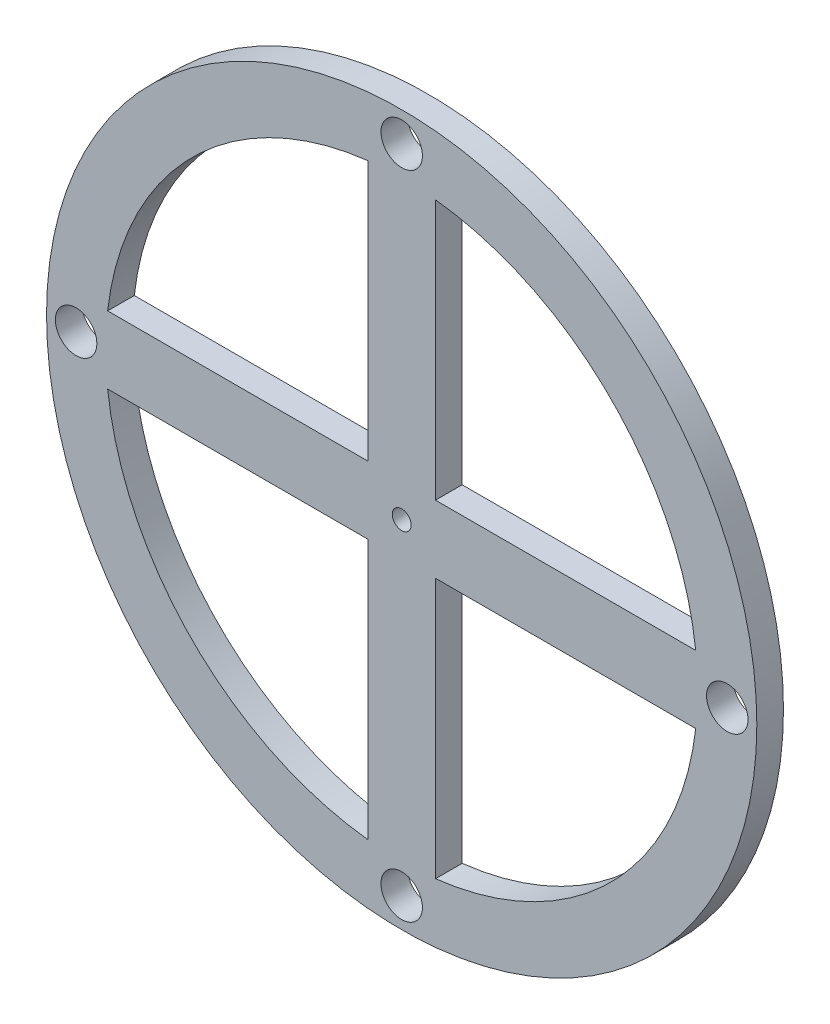
ISO-10303-21;
HEADER;
FILE_DESCRIPTION(('STEP AP214'),'2;1');
FILE_NAME('part.step','',(''),(''),'','','');
FILE_SCHEMA(('AUTOMOTIVE_DESIGN { 1 0 10303 214 1 1 1 1 }'));
ENDSEC;
DATA;
#1=APPLICATION_CONTEXT('core data for automotive mechanical design processes');
#2=APPLICATION_PROTOCOL_DEFINITION('international standard','automotive_design',2000,#1);
#3=PRODUCT_CONTEXT('',#1,'mechanical');
#4=PRODUCT('Part','Part','',(#3));
#5=PRODUCT_RELATED_PRODUCT_CATEGORY('part','',(#4));
#6=PRODUCT_DEFINITION_FORMATION('','',#4);
#7=PRODUCT_DEFINITION_CONTEXT('part definition',#1,'design');
#8=PRODUCT_DEFINITION('design','',#6,#7);
#9=PRODUCT_DEFINITION_SHAPE('','',#8);
#10=(LENGTH_UNIT() NAMED_UNIT(*) SI_UNIT(.MILLI.,.METRE.));
#11=(NAMED_UNIT(*) PLANE_ANGLE_UNIT() SI_UNIT($,.RADIAN.));
#12=(NAMED_UNIT(*) SI_UNIT($,.STERADIAN.) SOLID_ANGLE_UNIT());
#13=UNCERTAINTY_MEASURE_WITH_UNIT(LENGTH_MEASURE(1.E-05),#10,'distance_accuracy_value','');
#14=(GEOMETRIC_REPRESENTATION_CONTEXT(3) GLOBAL_UNCERTAINTY_ASSIGNED_CONTEXT((#13)) GLOBAL_UNIT_ASSIGNED_CONTEXT((#10,
#11,#12)) REPRESENTATION_CONTEXT('',''));
#15=CARTESIAN_POINT('',(0.,0.,0.));
#16=DIRECTION('',(0.,0.,1.));
#17=DIRECTION('',(1.,0.,0.));
#18=AXIS2_PLACEMENT_3D('',#15,#16,#17);
#19=CARTESIAN_POINT('',(0.,-5.71428571428571,4.5));
#20=DIRECTION('',(0.,1.,0.));
#21=DIRECTION('',(0.,0.,1.));
#22=AXIS2_PLACEMENT_3D('',#19,#20,#21);
#23=PLANE('',#22);
#24=DIRECTION('',(1.,0.,0.));
#25=VECTOR('',#24,1.);
#26=CARTESIAN_POINT('',(0.,-5.71428571428571,0.));
#27=LINE('',#26,#25);
#28=CARTESIAN_POINT('',(5.7142857142857,-5.71428571428571,0.));
#29=VERTEX_POINT('',#28);
#30=CARTESIAN_POINT('',(49.6723961448963,-5.71428571428571,0.));
#31=VERTEX_POINT('',#30);
#32=EDGE_CURVE('E145',#29,#31,#27,.T.);
#33=ORIENTED_EDGE('',*,*,#32,.T.);
#34=DIRECTION('',(0.,0.,-1.));
#35=VECTOR('',#34,1.);
#36=CARTESIAN_POINT('',(49.6723961448963,-5.71428571428571,4.5));
#37=LINE('',#36,#35);
#38=CARTESIAN_POINT('',(49.6723961448963,-5.71428571428571,4.5));
#39=VERTEX_POINT('',#38);
#40=EDGE_CURVE('E11',#39,#31,#37,.T.);
#41=ORIENTED_EDGE('',*,*,#40,.F.);
#42=DIRECTION('',(1.,0.,0.));
#43=VECTOR('',#42,1.);
#44=CARTESIAN_POINT('',(0.,-5.71428571428571,4.5));
#45=LINE('',#44,#43);
#46=CARTESIAN_POINT('',(5.7142857142857,-5.71428571428571,4.5));
#47=VERTEX_POINT('',#46);
#48=EDGE_CURVE('E136',#47,#39,#45,.T.);
#49=ORIENTED_EDGE('',*,*,#48,.F.);
#50=DIRECTION('',(0.,0.,-1.));
#51=VECTOR('',#50,1.);
#52=CARTESIAN_POINT('',(5.7142857142857,-5.71428571428571,4.5));
#53=LINE('',#52,#51);
#54=EDGE_CURVE('E60',#47,#29,#53,.T.);
#55=ORIENTED_EDGE('',*,*,#54,.T.);
#56=EDGE_LOOP('',(#33,#41,#49,#55));
#57=FACE_BOUND('',#56,.T.);
#58=ADVANCED_FACE('F41',(#57),#23,.F.);
#59=CARTESIAN_POINT('',(0.,0.,4.5));
#60=DIRECTION('',(0.,0.,-1.));
#61=DIRECTION('',(-1.,0.,0.));
#62=AXIS2_PLACEMENT_3D('',#59,#60,#61);
#63=CYLINDRICAL_SURFACE('',#62,50.);
#64=CARTESIAN_POINT('',(0.,0.,0.));
#65=DIRECTION('',(0.,0.,1.));
#66=DIRECTION('',(1.,0.,0.));
#67=AXIS2_PLACEMENT_3D('',#64,#65,#66);
#68=CIRCLE('',#67,50.);
#69=CARTESIAN_POINT('',(5.71428571428572,-49.6723961448963,0.));
#70=VERTEX_POINT('',#69);
#71=EDGE_CURVE('E204',#70,#31,#68,.T.);
#72=ORIENTED_EDGE('',*,*,#71,.F.);
#73=DIRECTION('',(0.,0.,-1.));
#74=VECTOR('',#73,1.);
#75=CARTESIAN_POINT('',(5.71428571428572,-49.6723961448963,4.5));
#76=LINE('',#75,#74);
#77=CARTESIAN_POINT('',(5.71428571428572,-49.6723961448963,4.5));
#78=VERTEX_POINT('',#77);
#79=EDGE_CURVE('E51',#78,#70,#76,.T.);
#80=ORIENTED_EDGE('',*,*,#79,.F.);
#81=CARTESIAN_POINT('',(0.,0.,4.5));
#82=DIRECTION('',(0.,0.,1.));
#83=DIRECTION('',(1.,0.,0.));
#84=AXIS2_PLACEMENT_3D('',#81,#82,#83);
#85=CIRCLE('',#84,50.);
#86=EDGE_CURVE('E141',#78,#39,#85,.T.);
#87=ORIENTED_EDGE('',*,*,#86,.T.);
#88=ORIENTED_EDGE('',*,*,#40,.T.);
#89=EDGE_LOOP('',(#72,#80,#87,#88));
#90=FACE_BOUND('',#89,.T.);
#91=ADVANCED_FACE('F148',(#90),#63,.F.);
#92=CARTESIAN_POINT('',(-49.6723961448963,-5.71428571428571,0.));
#93=VERTEX_POINT('',#92);
#94=CARTESIAN_POINT('',(-5.71428571428571,-49.6723961448963,0.));
#95=VERTEX_POINT('',#94);
#96=EDGE_CURVE('E217',#93,#95,#68,.T.);
#97=ORIENTED_EDGE('',*,*,#96,.F.);
#98=DIRECTION('',(0.,0.,-1.));
#99=VECTOR('',#98,1.);
#100=CARTESIAN_POINT('',(-49.6723961448963,-5.71428571428571,4.5));
#101=LINE('',#100,#99);
#102=CARTESIAN_POINT('',(-49.6723961448963,-5.71428571428571,4.5));
#103=VERTEX_POINT('',#102);
#104=EDGE_CURVE('E243',#103,#93,#101,.T.);
#105=ORIENTED_EDGE('',*,*,#104,.F.);
#106=CARTESIAN_POINT('',(-5.71428571428571,-49.6723961448963,4.5));
#107=VERTEX_POINT('',#106);
#108=EDGE_CURVE('E150',#103,#107,#85,.T.);
#109=ORIENTED_EDGE('',*,*,#108,.T.);
#110=DIRECTION('',(0.,0.,-1.));
#111=VECTOR('',#110,1.);
#112=CARTESIAN_POINT('',(-5.71428571428571,-49.6723961448963,4.5));
#113=LINE('',#112,#111);
#114=EDGE_CURVE('E245',#107,#95,#113,.T.);
#115=ORIENTED_EDGE('',*,*,#114,.T.);
#116=EDGE_LOOP('',(#97,#105,#109,#115));
#117=FACE_BOUND('',#116,.T.);
#118=ADVANCED_FACE('F285',(#117),#63,.F.);
#119=CARTESIAN_POINT('',(0.,-5.71428571428571,4.5));
#120=DIRECTION('',(0.,1.,0.));
#121=DIRECTION('',(0.,0.,1.));
#122=AXIS2_PLACEMENT_3D('',#119,#120,#121);
#123=PLANE('',#122);
#124=DIRECTION('',(1.,0.,0.));
#125=VECTOR('',#124,1.);
#126=CARTESIAN_POINT('',(0.,-5.71428571428571,0.));
#127=LINE('',#126,#125);
#128=CARTESIAN_POINT('',(-5.71428571428572,-5.71428571428571,0.));
#129=VERTEX_POINT('',#128);
#130=EDGE_CURVE('E218',#93,#129,#127,.T.);
#131=ORIENTED_EDGE('',*,*,#130,.T.);
#132=DIRECTION('',(0.,0.,-1.));
#133=VECTOR('',#132,1.);
#134=CARTESIAN_POINT('',(-5.71428571428572,-5.71428571428571,4.5));
#135=LINE('',#134,#133);
#136=CARTESIAN_POINT('',(-5.71428571428572,-5.71428571428571,4.5));
#137=VERTEX_POINT('',#136);
#138=EDGE_CURVE('E247',#137,#129,#135,.T.);
#139=ORIENTED_EDGE('',*,*,#138,.F.);
#140=DIRECTION('',(1.,0.,0.));
#141=VECTOR('',#140,1.);
#142=CARTESIAN_POINT('',(0.,-5.71428571428571,4.5));
#143=LINE('',#142,#141);
#144=EDGE_CURVE('E156',#103,#137,#143,.T.);
#145=ORIENTED_EDGE('',*,*,#144,.F.);
#146=ORIENTED_EDGE('',*,*,#104,.T.);
#147=EDGE_LOOP('',(#131,#139,#145,#146));
#148=FACE_BOUND('',#147,.T.);
#149=ADVANCED_FACE('F305',(#148),#123,.F.);
#150=CARTESIAN_POINT('',(-5.71428571428571,49.6723961448963,0.));
#151=VERTEX_POINT('',#150);
#152=CARTESIAN_POINT('',(-49.6723961448963,5.71428571428571,0.));
#153=VERTEX_POINT('',#152);
#154=EDGE_CURVE('E205',#151,#153,#68,.T.);
#155=ORIENTED_EDGE('',*,*,#154,.F.);
#156=DIRECTION('',(0.,0.,-1.));
#157=VECTOR('',#156,1.);
#158=CARTESIAN_POINT('',(-5.71428571428571,49.6723961448963,4.5));
#159=LINE('',#158,#157);
#160=CARTESIAN_POINT('',(-5.71428571428571,49.6723961448963,4.5));
#161=VERTEX_POINT('',#160);
#162=EDGE_CURVE('E248',#161,#151,#159,.T.);
#163=ORIENTED_EDGE('',*,*,#162,.F.);
#164=CARTESIAN_POINT('',(-49.6723961448963,5.71428571428571,4.5));
#165=VERTEX_POINT('',#164);
#166=EDGE_CURVE('E158',#161,#165,#85,.T.);
#167=ORIENTED_EDGE('',*,*,#166,.T.);
#168=DIRECTION('',(0.,0.,-1.));
#169=VECTOR('',#168,1.);
#170=CARTESIAN_POINT('',(-49.6723961448963,5.71428571428571,4.5));
#171=LINE('',#170,#169);
#172=EDGE_CURVE('E252',#165,#153,#171,.T.);
#173=ORIENTED_EDGE('',*,*,#172,.T.);
#174=EDGE_LOOP('',(#155,#163,#167,#173));
#175=FACE_BOUND('',#174,.T.);
#176=ADVANCED_FACE('F307',(#175),#63,.F.);
#177=CARTESIAN_POINT('',(-5.71428571428572,0.,4.5));
#178=DIRECTION('',(1.,0.,0.));
#179=DIRECTION('',(0.,1.,0.));
#180=AXIS2_PLACEMENT_3D('',#177,#178,#179);
#181=PLANE('',#180);
#182=DIRECTION('',(0.,-1.,0.));
#183=VECTOR('',#182,1.);
#184=CARTESIAN_POINT('',(-5.71428571428572,0.,0.));
#185=LINE('',#184,#183);
#186=CARTESIAN_POINT('',(-5.71428571428572,5.71428571428571,0.));
#187=VERTEX_POINT('',#186);
#188=EDGE_CURVE('E211',#151,#187,#185,.T.);
#189=ORIENTED_EDGE('',*,*,#188,.T.);
#190=DIRECTION('',(0.,0.,-1.));
#191=VECTOR('',#190,1.);
#192=CARTESIAN_POINT('',(-5.71428571428572,5.71428571428571,4.5));
#193=LINE('',#192,#191);
#194=CARTESIAN_POINT('',(-5.71428571428572,5.71428571428571,4.5));
#195=VERTEX_POINT('',#194);
#196=EDGE_CURVE('E254',#195,#187,#193,.T.);
#197=ORIENTED_EDGE('',*,*,#196,.F.);
#198=DIRECTION('',(0.,-1.,0.));
#199=VECTOR('',#198,1.);
#200=CARTESIAN_POINT('',(-5.71428571428572,0.,4.5));
#201=LINE('',#200,#199);
#202=EDGE_CURVE('E168',#161,#195,#201,.T.);
#203=ORIENTED_EDGE('',*,*,#202,.F.);
#204=ORIENTED_EDGE('',*,*,#162,.T.);
#205=EDGE_LOOP('',(#189,#197,#203,#204));
#206=FACE_BOUND('',#205,.T.);
#207=ADVANCED_FACE('F309',(#206),#181,.F.);
#208=CARTESIAN_POINT('',(49.6723961448963,5.71428571428571,0.));
#209=VERTEX_POINT('',#208);
#210=CARTESIAN_POINT('',(5.71428571428572,49.6723961448963,0.));
#211=VERTEX_POINT('',#210);
#212=EDGE_CURVE('E200',#209,#211,#68,.T.);
#213=ORIENTED_EDGE('',*,*,#212,.F.);
#214=DIRECTION('',(0.,0.,-1.));
#215=VECTOR('',#214,1.);
#216=CARTESIAN_POINT('',(49.6723961448963,5.71428571428571,4.5));
#217=LINE('',#216,#215);
#218=CARTESIAN_POINT('',(49.6723961448963,5.71428571428571,4.5));
#219=VERTEX_POINT('',#218);
#220=EDGE_CURVE('E45',#219,#209,#217,.T.);
#221=ORIENTED_EDGE('',*,*,#220,.F.);
#222=CARTESIAN_POINT('',(5.71428571428572,49.6723961448963,4.5));
#223=VERTEX_POINT('',#222);
#224=EDGE_CURVE('E151',#219,#223,#85,.T.);
#225=ORIENTED_EDGE('',*,*,#224,.T.);
#226=DIRECTION('',(0.,0.,-1.));
#227=VECTOR('',#226,1.);
#228=CARTESIAN_POINT('',(5.71428571428572,49.6723961448963,4.5));
#229=LINE('',#228,#227);
#230=EDGE_CURVE('E199',#223,#211,#229,.T.);
#231=ORIENTED_EDGE('',*,*,#230,.T.);
#232=EDGE_LOOP('',(#213,#221,#225,#231));
#233=FACE_BOUND('',#232,.T.);
#234=ADVANCED_FACE('F262',(#233),#63,.F.);
#235=CARTESIAN_POINT('',(0.,5.71428571428571,4.5));
#236=DIRECTION('',(0.,1.,0.));
#237=DIRECTION('',(-1.,0.,0.));
#238=AXIS2_PLACEMENT_3D('',#235,#236,#237);
#239=PLANE('',#238);
#240=DIRECTION('',(1.,0.,0.));
#241=VECTOR('',#240,1.);
#242=CARTESIAN_POINT('',(0.,5.71428571428571,0.));
#243=LINE('',#242,#241);
#244=CARTESIAN_POINT('',(5.71428571428571,5.71428571428571,0.));
#245=VERTEX_POINT('',#244);
#246=EDGE_CURVE('E203',#245,#209,#243,.T.);
#247=ORIENTED_EDGE('',*,*,#246,.F.);
#248=DIRECTION('',(0.,0.,-1.));
#249=VECTOR('',#248,1.);
#250=CARTESIAN_POINT('',(5.71428571428571,5.71428571428571,4.5));
#251=LINE('',#250,#249);
#252=CARTESIAN_POINT('',(5.71428571428571,5.71428571428571,4.5));
#253=VERTEX_POINT('',#252);
#254=EDGE_CURVE('E257',#253,#245,#251,.T.);
#255=ORIENTED_EDGE('',*,*,#254,.F.);
#256=DIRECTION('',(1.,0.,0.));
#257=VECTOR('',#256,1.);
#258=CARTESIAN_POINT('',(0.,5.71428571428571,4.5));
#259=LINE('',#258,#257);
#260=EDGE_CURVE('E159',#253,#219,#259,.T.);
#261=ORIENTED_EDGE('',*,*,#260,.T.);
#262=ORIENTED_EDGE('',*,*,#220,.T.);
#263=EDGE_LOOP('',(#247,#255,#261,#262));
#264=FACE_BOUND('',#263,.T.);
#265=ADVANCED_FACE('F43',(#264),#239,.T.);
#266=CARTESIAN_POINT('',(0.,55.,4.5));
#267=DIRECTION('',(0.,0.,-1.));
#268=DIRECTION('',(-1.,0.,0.));
#269=AXIS2_PLACEMENT_3D('',#266,#267,#268);
#270=CYLINDRICAL_SURFACE('',#269,3.5);
#271=CARTESIAN_POINT('',(0.,55.,4.5));
#272=DIRECTION('',(0.,0.,1.));
#273=DIRECTION('',(1.,0.,0.));
#274=AXIS2_PLACEMENT_3D('',#271,#272,#273);
#275=CIRCLE('',#274,3.5);
#276=CARTESIAN_POINT('',(3.50000000000001,55.,4.5));
#277=VERTEX_POINT('',#276);
#278=EDGE_CURVE('E193',#277,#277,#275,.F.);
#279=ORIENTED_EDGE('',*,*,#278,.F.);
#280=EDGE_LOOP('',(#279));
#281=FACE_BOUND('',#280,.T.);
#282=CARTESIAN_POINT('',(0.,55.,0.));
#283=DIRECTION('',(0.,0.,1.));
#284=DIRECTION('',(1.,0.,0.));
#285=AXIS2_PLACEMENT_3D('',#282,#283,#284);
#286=CIRCLE('',#285,3.5);
#287=CARTESIAN_POINT('',(3.50000000000001,55.,0.));
#288=VERTEX_POINT('',#287);
#289=EDGE_CURVE('E165',#288,#288,#286,.F.);
#290=ORIENTED_EDGE('',*,*,#289,.T.);
#291=EDGE_LOOP('',(#290));
#292=FACE_BOUND('',#291,.T.);
#293=ADVANCED_FACE('F349',(#281,#292),#270,.F.);
#294=CARTESIAN_POINT('',(0.,0.,4.5));
#295=DIRECTION('',(0.,0.,-1.));
#296=DIRECTION('',(-1.,0.,0.));
#297=AXIS2_PLACEMENT_3D('',#294,#295,#296);
#298=CYLINDRICAL_SURFACE('',#297,60.);
#299=CARTESIAN_POINT('',(0.,0.,4.5));
#300=DIRECTION('',(0.,0.,1.));
#301=DIRECTION('',(1.,0.,0.));
#302=AXIS2_PLACEMENT_3D('',#299,#300,#301);
#303=CIRCLE('',#302,60.);
#304=CARTESIAN_POINT('',(60.,0.,4.5));
#305=VERTEX_POINT('',#304);
#306=EDGE_CURVE('E152',#305,#305,#303,.T.);
#307=ORIENTED_EDGE('',*,*,#306,.F.);
#308=EDGE_LOOP('',(#307));
#309=FACE_BOUND('',#308,.T.);
#310=CARTESIAN_POINT('',(0.,0.,0.));
#311=DIRECTION('',(0.,0.,1.));
#312=DIRECTION('',(1.,0.,0.));
#313=AXIS2_PLACEMENT_3D('',#310,#311,#312);
#314=CIRCLE('',#313,60.);
#315=CARTESIAN_POINT('',(60.,0.,0.));
#316=VERTEX_POINT('',#315);
#317=EDGE_CURVE('E237',#316,#316,#314,.T.);
#318=ORIENTED_EDGE('',*,*,#317,.T.);
#319=EDGE_LOOP('',(#318));
#320=FACE_BOUND('',#319,.T.);
#321=ADVANCED_FACE('F351',(#309,#320),#298,.T.);
#322=CARTESIAN_POINT('',(5.7142857142857,0.,4.5));
#323=DIRECTION('',(1.,0.,0.));
#324=DIRECTION('',(0.,1.,0.));
#325=AXIS2_PLACEMENT_3D('',#322,#323,#324);
#326=PLANE('',#325);
#327=DIRECTION('',(0.,-1.,0.));
#328=VECTOR('',#327,1.);
#329=CARTESIAN_POINT('',(5.7142857142857,0.,0.));
#330=LINE('',#329,#328);
#331=EDGE_CURVE('E234',#29,#70,#330,.T.);
#332=ORIENTED_EDGE('',*,*,#331,.F.);
#333=ORIENTED_EDGE('',*,*,#54,.F.);
#334=DIRECTION('',(0.,-1.,0.));
#335=VECTOR('',#334,1.);
#336=CARTESIAN_POINT('',(5.7142857142857,0.,4.5));
#337=LINE('',#336,#335);
#338=EDGE_CURVE('E142',#47,#78,#337,.T.);
#339=ORIENTED_EDGE('',*,*,#338,.T.);
#340=ORIENTED_EDGE('',*,*,#79,.T.);
#341=EDGE_LOOP('',(#332,#333,#339,#340));
#342=FACE_BOUND('',#341,.T.);
#343=ADVANCED_FACE('F293',(#342),#326,.T.);
#344=CARTESIAN_POINT('',(0.,-55.,4.5));
#345=DIRECTION('',(0.,0.,-1.));
#346=DIRECTION('',(-1.,0.,0.));
#347=AXIS2_PLACEMENT_3D('',#344,#345,#346);
#348=CYLINDRICAL_SURFACE('',#347,3.5);
#349=CARTESIAN_POINT('',(0.,-55.,4.5));
#350=DIRECTION('',(0.,0.,1.));
#351=DIRECTION('',(1.,0.,0.));
#352=AXIS2_PLACEMENT_3D('',#349,#350,#351);
#353=CIRCLE('',#352,3.5);
#354=CARTESIAN_POINT('',(3.50000000000001,-55.,4.5));
#355=VERTEX_POINT('',#354);
#356=EDGE_CURVE('E143',#355,#355,#353,.T.);
#357=ORIENTED_EDGE('',*,*,#356,.T.);
#358=EDGE_LOOP('',(#357));
#359=FACE_BOUND('',#358,.T.);
#360=CARTESIAN_POINT('',(0.,-55.,0.));
#361=DIRECTION('',(0.,0.,1.));
#362=DIRECTION('',(1.,0.,0.));
#363=AXIS2_PLACEMENT_3D('',#360,#361,#362);
#364=CIRCLE('',#363,3.5);
#365=CARTESIAN_POINT('',(3.50000000000001,-55.,0.));
#366=VERTEX_POINT('',#365);
#367=EDGE_CURVE('E230',#366,#366,#364,.T.);
#368=ORIENTED_EDGE('',*,*,#367,.F.);
#369=EDGE_LOOP('',(#368));
#370=FACE_BOUND('',#369,.T.);
#371=ADVANCED_FACE('F289',(#359,#370),#348,.F.);
#372=CARTESIAN_POINT('',(55.,0.,4.5));
#373=DIRECTION('',(0.,0.,-1.));
#374=DIRECTION('',(-1.,0.,0.));
#375=AXIS2_PLACEMENT_3D('',#372,#373,#374);
#376=CYLINDRICAL_SURFACE('',#375,3.5);
#377=CARTESIAN_POINT('',(55.,0.,4.5));
#378=DIRECTION('',(0.,0.,1.));
#379=DIRECTION('',(1.,0.,0.));
#380=AXIS2_PLACEMENT_3D('',#377,#378,#379);
#381=CIRCLE('',#380,3.5);
#382=CARTESIAN_POINT('',(58.5,0.,4.5));
#383=VERTEX_POINT('',#382);
#384=EDGE_CURVE('E186',#383,#383,#381,.T.);
#385=ORIENTED_EDGE('',*,*,#384,.T.);
#386=EDGE_LOOP('',(#385));
#387=FACE_BOUND('',#386,.T.);
#388=CARTESIAN_POINT('',(55.,0.,0.));
#389=DIRECTION('',(0.,0.,1.));
#390=DIRECTION('',(1.,0.,0.));
#391=AXIS2_PLACEMENT_3D('',#388,#389,#390);
#392=CIRCLE('',#391,3.5);
#393=CARTESIAN_POINT('',(58.5,0.,0.));
#394=VERTEX_POINT('',#393);
#395=EDGE_CURVE('E227',#394,#394,#392,.T.);
#396=ORIENTED_EDGE('',*,*,#395,.F.);
#397=EDGE_LOOP('',(#396));
#398=FACE_BOUND('',#397,.T.);
#399=ADVANCED_FACE('F292',(#387,#398),#376,.F.);
#400=CARTESIAN_POINT('',(-55.,0.,4.5));
#401=DIRECTION('',(0.,0.,-1.));
#402=DIRECTION('',(-1.,0.,0.));
#403=AXIS2_PLACEMENT_3D('',#400,#401,#402);
#404=CYLINDRICAL_SURFACE('',#403,3.5);
#405=CARTESIAN_POINT('',(-55.,0.,4.5));
#406=DIRECTION('',(0.,0.,1.));
#407=DIRECTION('',(1.,0.,0.));
#408=AXIS2_PLACEMENT_3D('',#405,#406,#407);
#409=CIRCLE('',#408,3.5);
#410=CARTESIAN_POINT('',(-51.5,0.,4.5));
#411=VERTEX_POINT('',#410);
#412=EDGE_CURVE('E183',#411,#411,#409,.F.);
#413=ORIENTED_EDGE('',*,*,#412,.F.);
#414=EDGE_LOOP('',(#413));
#415=FACE_BOUND('',#414,.T.);
#416=CARTESIAN_POINT('',(-55.,0.,0.));
#417=DIRECTION('',(0.,0.,1.));
#418=DIRECTION('',(1.,0.,0.));
#419=AXIS2_PLACEMENT_3D('',#416,#417,#418);
#420=CIRCLE('',#419,3.5);
#421=CARTESIAN_POINT('',(-51.5,0.,0.));
#422=VERTEX_POINT('',#421);
#423=EDGE_CURVE('E224',#422,#422,#420,.F.);
#424=ORIENTED_EDGE('',*,*,#423,.T.);
#425=EDGE_LOOP('',(#424));
#426=FACE_BOUND('',#425,.T.);
#427=ADVANCED_FACE('F297',(#415,#426),#404,.F.);
#428=CARTESIAN_POINT('',(-5.71428571428572,0.,4.5));
#429=DIRECTION('',(1.,0.,0.));
#430=DIRECTION('',(0.,1.,0.));
#431=AXIS2_PLACEMENT_3D('',#428,#429,#430);
#432=PLANE('',#431);
#433=DIRECTION('',(0.,-1.,0.));
#434=VECTOR('',#433,1.);
#435=CARTESIAN_POINT('',(-5.71428571428572,0.,0.));
#436=LINE('',#435,#434);
#437=EDGE_CURVE('E221',#129,#95,#436,.T.);
#438=ORIENTED_EDGE('',*,*,#437,.T.);
#439=ORIENTED_EDGE('',*,*,#114,.F.);
#440=DIRECTION('',(0.,-1.,0.));
#441=VECTOR('',#440,1.);
#442=CARTESIAN_POINT('',(-5.71428571428572,0.,4.5));
#443=LINE('',#442,#441);
#444=EDGE_CURVE('E181',#137,#107,#443,.T.);
#445=ORIENTED_EDGE('',*,*,#444,.F.);
#446=ORIENTED_EDGE('',*,*,#138,.T.);
#447=EDGE_LOOP('',(#438,#439,#445,#446));
#448=FACE_BOUND('',#447,.T.);
#449=ADVANCED_FACE('F276',(#448),#432,.F.);
#450=CARTESIAN_POINT('',(0.,5.71428571428571,4.5));
#451=DIRECTION('',(0.,1.,0.));
#452=DIRECTION('',(0.,0.,1.));
#453=AXIS2_PLACEMENT_3D('',#450,#451,#452);
#454=PLANE('',#453);
#455=DIRECTION('',(1.,0.,0.));
#456=VECTOR('',#455,1.);
#457=CARTESIAN_POINT('',(0.,5.71428571428571,0.));
#458=LINE('',#457,#456);
#459=EDGE_CURVE('E214',#153,#187,#458,.T.);
#460=ORIENTED_EDGE('',*,*,#459,.F.);
#461=ORIENTED_EDGE('',*,*,#172,.F.);
#462=DIRECTION('',(1.,0.,0.));
#463=VECTOR('',#462,1.);
#464=CARTESIAN_POINT('',(0.,5.71428571428571,4.5));
#465=LINE('',#464,#463);
#466=EDGE_CURVE('E157',#165,#195,#465,.T.);
#467=ORIENTED_EDGE('',*,*,#466,.T.);
#468=ORIENTED_EDGE('',*,*,#196,.T.);
#469=EDGE_LOOP('',(#460,#461,#467,#468));
#470=FACE_BOUND('',#469,.T.);
#471=ADVANCED_FACE('F269',(#470),#454,.T.);
#472=CARTESIAN_POINT('',(5.71428571428571,0.,4.5));
#473=DIRECTION('',(1.,0.,0.));
#474=DIRECTION('',(0.,1.,0.));
#475=AXIS2_PLACEMENT_3D('',#472,#473,#474);
#476=PLANE('',#475);
#477=DIRECTION('',(0.,-1.,0.));
#478=VECTOR('',#477,1.);
#479=CARTESIAN_POINT('',(5.71428571428571,0.,0.));
#480=LINE('',#479,#478);
#481=EDGE_CURVE('E208',#211,#245,#480,.T.);
#482=ORIENTED_EDGE('',*,*,#481,.F.);
#483=ORIENTED_EDGE('',*,*,#230,.F.);
#484=DIRECTION('',(0.,-1.,0.));
#485=VECTOR('',#484,1.);
#486=CARTESIAN_POINT('',(5.71428571428571,0.,4.5));
#487=LINE('',#486,#485);
#488=EDGE_CURVE('E163',#223,#253,#487,.T.);
#489=ORIENTED_EDGE('',*,*,#488,.T.);
#490=ORIENTED_EDGE('',*,*,#254,.T.);
#491=EDGE_LOOP('',(#482,#483,#489,#490));
#492=FACE_BOUND('',#491,.T.);
#493=ADVANCED_FACE('F266',(#492),#476,.T.);
#494=CARTESIAN_POINT('',(0.,0.,4.5));
#495=DIRECTION('',(0.,0.,-1.));
#496=DIRECTION('',(-1.,0.,0.));
#497=AXIS2_PLACEMENT_3D('',#494,#495,#496);
#498=CYLINDRICAL_SURFACE('',#497,1.595);
#499=CARTESIAN_POINT('',(0.,0.,4.5));
#500=DIRECTION('',(0.,0.,1.));
#501=DIRECTION('',(1.,0.,0.));
#502=AXIS2_PLACEMENT_3D('',#499,#500,#501);
#503=CIRCLE('',#502,1.595);
#504=CARTESIAN_POINT('',(1.595,0.,4.5));
#505=VERTEX_POINT('',#504);
#506=EDGE_CURVE('E196',#505,#505,#503,.T.);
#507=ORIENTED_EDGE('',*,*,#506,.T.);
#508=EDGE_LOOP('',(#507));
#509=FACE_BOUND('',#508,.T.);
#510=CARTESIAN_POINT('',(0.,0.,0.));
#511=DIRECTION('',(0.,0.,1.));
#512=DIRECTION('',(1.,0.,0.));
#513=AXIS2_PLACEMENT_3D('',#510,#511,#512);
#514=CIRCLE('',#513,1.595);
#515=CARTESIAN_POINT('',(1.595,0.,0.));
#516=VERTEX_POINT('',#515);
#517=EDGE_CURVE('E160',#516,#516,#514,.T.);
#518=ORIENTED_EDGE('',*,*,#517,.F.);
#519=EDGE_LOOP('',(#518));
#520=FACE_BOUND('',#519,.T.);
#521=ADVANCED_FACE('F268',(#509,#520),#498,.F.);
#522=CARTESIAN_POINT('',(0.,0.,4.5));
#523=DIRECTION('',(0.,0.,1.));
#524=DIRECTION('',(1.,0.,0.));
#525=AXIS2_PLACEMENT_3D('',#522,#523,#524);
#526=PLANE('',#525);
#527=ORIENTED_EDGE('',*,*,#224,.F.);
#528=ORIENTED_EDGE('',*,*,#260,.F.);
#529=ORIENTED_EDGE('',*,*,#488,.F.);
#530=EDGE_LOOP('',(#527,#528,#529));
#531=FACE_BOUND('',#530,.T.);
#532=ORIENTED_EDGE('',*,*,#166,.F.);
#533=ORIENTED_EDGE('',*,*,#202,.T.);
#534=ORIENTED_EDGE('',*,*,#466,.F.);
#535=EDGE_LOOP('',(#532,#533,#534));
#536=FACE_BOUND('',#535,.T.);
#537=ORIENTED_EDGE('',*,*,#108,.F.);
#538=ORIENTED_EDGE('',*,*,#144,.T.);
#539=ORIENTED_EDGE('',*,*,#444,.T.);
#540=EDGE_LOOP('',(#537,#538,#539));
#541=FACE_BOUND('',#540,.T.);
#542=ORIENTED_EDGE('',*,*,#412,.T.);
#543=EDGE_LOOP('',(#542));
#544=FACE_BOUND('',#543,.T.);
#545=ORIENTED_EDGE('',*,*,#384,.F.);
#546=EDGE_LOOP('',(#545));
#547=FACE_BOUND('',#546,.T.);
#548=ORIENTED_EDGE('',*,*,#356,.F.);
#549=EDGE_LOOP('',(#548));
#550=FACE_BOUND('',#549,.T.);
#551=ORIENTED_EDGE('',*,*,#48,.T.);
#552=ORIENTED_EDGE('',*,*,#86,.F.);
#553=ORIENTED_EDGE('',*,*,#338,.F.);
#554=EDGE_LOOP('',(#551,#552,#553));
#555=FACE_BOUND('',#554,.T.);
#556=ORIENTED_EDGE('',*,*,#306,.T.);
#557=EDGE_LOOP('',(#556));
#558=FACE_BOUND('',#557,.T.);
#559=ORIENTED_EDGE('',*,*,#278,.T.);
#560=EDGE_LOOP('',(#559));
#561=FACE_BOUND('',#560,.T.);
#562=ORIENTED_EDGE('',*,*,#506,.F.);
#563=EDGE_LOOP('',(#562));
#564=FACE_BOUND('',#563,.T.);
#565=ADVANCED_FACE('F138',(#531,#536,#541,#544,#547,#550,#555,#558,#561,#564),#526,.T.);
#566=CARTESIAN_POINT('',(0.,0.,0.));
#567=DIRECTION('',(0.,0.,1.));
#568=DIRECTION('',(1.,0.,0.));
#569=AXIS2_PLACEMENT_3D('',#566,#567,#568);
#570=PLANE('',#569);
#571=ORIENTED_EDGE('',*,*,#212,.T.);
#572=ORIENTED_EDGE('',*,*,#481,.T.);
#573=ORIENTED_EDGE('',*,*,#246,.T.);
#574=EDGE_LOOP('',(#571,#572,#573));
#575=FACE_BOUND('',#574,.T.);
#576=ORIENTED_EDGE('',*,*,#154,.T.);
#577=ORIENTED_EDGE('',*,*,#459,.T.);
#578=ORIENTED_EDGE('',*,*,#188,.F.);
#579=EDGE_LOOP('',(#576,#577,#578));
#580=FACE_BOUND('',#579,.T.);
#581=ORIENTED_EDGE('',*,*,#96,.T.);
#582=ORIENTED_EDGE('',*,*,#437,.F.);
#583=ORIENTED_EDGE('',*,*,#130,.F.);
#584=EDGE_LOOP('',(#581,#582,#583));
#585=FACE_BOUND('',#584,.T.);
#586=ORIENTED_EDGE('',*,*,#423,.F.);
#587=EDGE_LOOP('',(#586));
#588=FACE_BOUND('',#587,.T.);
#589=ORIENTED_EDGE('',*,*,#395,.T.);
#590=EDGE_LOOP('',(#589));
#591=FACE_BOUND('',#590,.T.);
#592=ORIENTED_EDGE('',*,*,#367,.T.);
#593=EDGE_LOOP('',(#592));
#594=FACE_BOUND('',#593,.T.);
#595=ORIENTED_EDGE('',*,*,#32,.F.);
#596=ORIENTED_EDGE('',*,*,#331,.T.);
#597=ORIENTED_EDGE('',*,*,#71,.T.);
#598=EDGE_LOOP('',(#595,#596,#597));
#599=FACE_BOUND('',#598,.T.);
#600=ORIENTED_EDGE('',*,*,#317,.F.);
#601=EDGE_LOOP('',(#600));
#602=FACE_BOUND('',#601,.T.);
#603=ORIENTED_EDGE('',*,*,#289,.F.);
#604=EDGE_LOOP('',(#603));
#605=FACE_BOUND('',#604,.T.);
#606=ORIENTED_EDGE('',*,*,#517,.T.);
#607=EDGE_LOOP('',(#606));
#608=FACE_BOUND('',#607,.T.);
#609=ADVANCED_FACE('F264',(#575,#580,#585,#588,#591,#594,#599,#602,#605,#608),#570,.F.);
#610=CLOSED_SHELL('',(#58,#91,#118,#149,#176,#207,#234,#265,#293,#321,#343,#371,#399,#427,#449,
#471,#493,#521,#565,#609));
#611=MANIFOLD_SOLID_BREP('B2',#610);
#612=ADVANCED_BREP_SHAPE_REPRESENTATION('',(#18,#611),#14);
#613=SHAPE_DEFINITION_REPRESENTATION(#9,#612);
ENDSEC;
END-ISO-10303-21;
